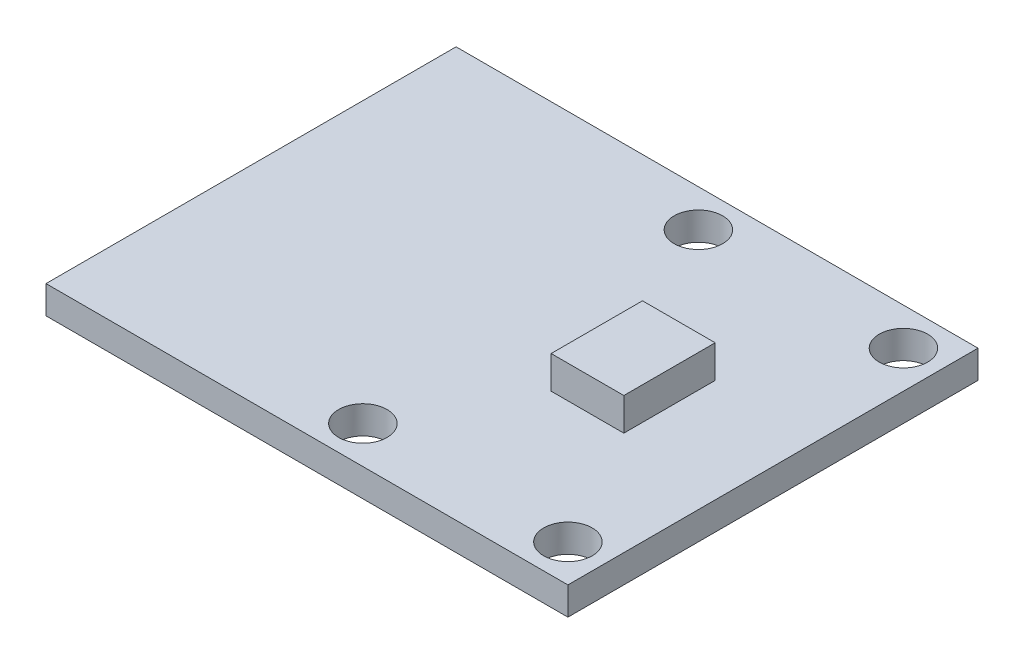
ISO-10303-21;
HEADER;
FILE_DESCRIPTION(('STEP AP214'),'2;1');
FILE_NAME('part.step','',(''),(''),'','','');
FILE_SCHEMA(('AUTOMOTIVE_DESIGN { 1 0 10303 214 1 1 1 1 }'));
ENDSEC;
DATA;
#1=APPLICATION_CONTEXT('core data for automotive mechanical design processes');
#2=APPLICATION_PROTOCOL_DEFINITION('international standard','automotive_design',2000,#1);
#3=PRODUCT_CONTEXT('',#1,'mechanical');
#4=PRODUCT('Part','Part','',(#3));
#5=PRODUCT_RELATED_PRODUCT_CATEGORY('part','',(#4));
#6=PRODUCT_DEFINITION_FORMATION('','',#4);
#7=PRODUCT_DEFINITION_CONTEXT('part definition',#1,'design');
#8=PRODUCT_DEFINITION('design','',#6,#7);
#9=PRODUCT_DEFINITION_SHAPE('','',#8);
#10=(LENGTH_UNIT() NAMED_UNIT(*) SI_UNIT(.MILLI.,.METRE.));
#11=(NAMED_UNIT(*) PLANE_ANGLE_UNIT() SI_UNIT($,.RADIAN.));
#12=(NAMED_UNIT(*) SI_UNIT($,.STERADIAN.) SOLID_ANGLE_UNIT());
#13=UNCERTAINTY_MEASURE_WITH_UNIT(LENGTH_MEASURE(1.E-05),#10,'distance_accuracy_value','');
#14=(GEOMETRIC_REPRESENTATION_CONTEXT(3) GLOBAL_UNCERTAINTY_ASSIGNED_CONTEXT((#13)) GLOBAL_UNIT_ASSIGNED_CONTEXT((#10,
#11,#12)) REPRESENTATION_CONTEXT('',''));
#15=CARTESIAN_POINT('',(0.,0.,0.));
#16=DIRECTION('',(0.,0.,1.));
#17=DIRECTION('',(1.,0.,0.));
#18=AXIS2_PLACEMENT_3D('',#15,#16,#17);
#19=CARTESIAN_POINT('',(0.,1.5,0.));
#20=DIRECTION('',(0.,-1.,0.));
#21=DIRECTION('',(0.,0.,-1.));
#22=AXIS2_PLACEMENT_3D('',#19,#20,#21);
#23=PLANE('',#22);
#24=CARTESIAN_POINT('',(1.,1.5,9.));
#25=DIRECTION('',(0.,1.,0.));
#26=DIRECTION('',(0.,0.,1.));
#27=AXIS2_PLACEMENT_3D('',#24,#25,#26);
#28=CIRCLE('',#27,1.3);
#29=CARTESIAN_POINT('',(1.,1.5,10.3));
#30=VERTEX_POINT('',#29);
#31=EDGE_CURVE('E184',#30,#30,#28,.T.);
#32=ORIENTED_EDGE('',*,*,#31,.F.);
#33=EDGE_LOOP('',(#32));
#34=FACE_BOUND('',#33,.T.);
#35=CARTESIAN_POINT('',(12.,1.5,-9.));
#36=DIRECTION('',(0.,1.,0.));
#37=DIRECTION('',(0.,0.,-1.));
#38=AXIS2_PLACEMENT_3D('',#35,#36,#37);
#39=CIRCLE('',#38,1.3);
#40=CARTESIAN_POINT('',(12.,1.5,-10.3));
#41=VERTEX_POINT('',#40);
#42=EDGE_CURVE('E185',#41,#41,#39,.T.);
#43=ORIENTED_EDGE('',*,*,#42,.F.);
#44=EDGE_LOOP('',(#43));
#45=FACE_BOUND('',#44,.T.);
#46=CARTESIAN_POINT('',(1.,1.5,-9.));
#47=DIRECTION('',(0.,1.,0.));
#48=DIRECTION('',(0.,0.,-1.));
#49=AXIS2_PLACEMENT_3D('',#46,#47,#48);
#50=CIRCLE('',#49,1.3);
#51=CARTESIAN_POINT('',(1.,1.5,-10.3));
#52=VERTEX_POINT('',#51);
#53=EDGE_CURVE('E188',#52,#52,#50,.T.);
#54=ORIENTED_EDGE('',*,*,#53,.F.);
#55=EDGE_LOOP('',(#54));
#56=FACE_BOUND('',#55,.T.);
#57=CARTESIAN_POINT('',(12.,1.5,9.));
#58=DIRECTION('',(0.,1.,0.));
#59=DIRECTION('',(0.,0.,1.));
#60=AXIS2_PLACEMENT_3D('',#57,#58,#59);
#61=CIRCLE('',#60,1.3);
#62=CARTESIAN_POINT('',(12.,1.5,10.3));
#63=VERTEX_POINT('',#62);
#64=EDGE_CURVE('E157',#63,#63,#61,.T.);
#65=ORIENTED_EDGE('',*,*,#64,.F.);
#66=EDGE_LOOP('',(#65));
#67=FACE_BOUND('',#66,.T.);
#68=DIRECTION('',(0.,0.,-1.));
#69=VECTOR('',#68,1.);
#70=CARTESIAN_POINT('',(14.,1.5,11.));
#71=LINE('',#70,#69);
#72=CARTESIAN_POINT('',(14.,1.5,11.));
#73=VERTEX_POINT('',#72);
#74=CARTESIAN_POINT('',(14.,1.5,-11.));
#75=VERTEX_POINT('',#74);
#76=EDGE_CURVE('E131',#73,#75,#71,.T.);
#77=ORIENTED_EDGE('',*,*,#76,.T.);
#78=DIRECTION('',(-1.,0.,0.));
#79=VECTOR('',#78,1.);
#80=CARTESIAN_POINT('',(-14.,1.5,-11.));
#81=LINE('',#80,#79);
#82=CARTESIAN_POINT('',(-14.,1.5,-11.));
#83=VERTEX_POINT('',#82);
#84=EDGE_CURVE('E134',#75,#83,#81,.T.);
#85=ORIENTED_EDGE('',*,*,#84,.T.);
#86=DIRECTION('',(0.,0.,1.));
#87=VECTOR('',#86,1.);
#88=CARTESIAN_POINT('',(-14.,1.5,11.));
#89=LINE('',#88,#87);
#90=CARTESIAN_POINT('',(-14.,1.5,11.));
#91=VERTEX_POINT('',#90);
#92=EDGE_CURVE('E137',#83,#91,#89,.T.);
#93=ORIENTED_EDGE('',*,*,#92,.T.);
#94=DIRECTION('',(1.,0.,0.));
#95=VECTOR('',#94,1.);
#96=CARTESIAN_POINT('',(-14.,1.5,11.));
#97=LINE('',#96,#95);
#98=EDGE_CURVE('E139',#91,#73,#97,.T.);
#99=ORIENTED_EDGE('',*,*,#98,.T.);
#100=EDGE_LOOP('',(#77,#85,#93,#99));
#101=FACE_BOUND('',#100,.T.);
#102=DIRECTION('',(0.,0.,-1.));
#103=VECTOR('',#102,1.);
#104=CARTESIAN_POINT('',(8.45,1.5,2.45));
#105=LINE('',#104,#103);
#106=CARTESIAN_POINT('',(8.45,1.5,2.45));
#107=VERTEX_POINT('',#106);
#108=CARTESIAN_POINT('',(8.45,1.5,-2.45));
#109=VERTEX_POINT('',#108);
#110=EDGE_CURVE('E121',#107,#109,#105,.T.);
#111=ORIENTED_EDGE('',*,*,#110,.F.);
#112=DIRECTION('',(1.,0.,0.));
#113=VECTOR('',#112,1.);
#114=CARTESIAN_POINT('',(4.55,1.5,2.45));
#115=LINE('',#114,#113);
#116=CARTESIAN_POINT('',(4.55,1.5,2.45));
#117=VERTEX_POINT('',#116);
#118=EDGE_CURVE('E118',#117,#107,#115,.T.);
#119=ORIENTED_EDGE('',*,*,#118,.F.);
#120=DIRECTION('',(0.,0.,1.));
#121=VECTOR('',#120,1.);
#122=CARTESIAN_POINT('',(4.55,1.5,2.45));
#123=LINE('',#122,#121);
#124=CARTESIAN_POINT('',(4.55,1.5,-2.45));
#125=VERTEX_POINT('',#124);
#126=EDGE_CURVE('E56',#125,#117,#123,.T.);
#127=ORIENTED_EDGE('',*,*,#126,.F.);
#128=DIRECTION('',(-1.,0.,0.));
#129=VECTOR('',#128,1.);
#130=CARTESIAN_POINT('',(4.55,1.5,-2.45));
#131=LINE('',#130,#129);
#132=EDGE_CURVE('E51',#109,#125,#131,.T.);
#133=ORIENTED_EDGE('',*,*,#132,.F.);
#134=EDGE_LOOP('',(#111,#119,#127,#133));
#135=FACE_BOUND('',#134,.T.);
#136=ADVANCED_FACE('F34',(#34,#45,#56,#67,#101,#135),#23,.F.);
#137=CARTESIAN_POINT('',(14.,1.5,11.));
#138=DIRECTION('',(-1.,0.,0.));
#139=DIRECTION('',(0.,0.,1.));
#140=AXIS2_PLACEMENT_3D('',#137,#138,#139);
#141=PLANE('',#140);
#142=DIRECTION('',(0.,0.,-1.));
#143=VECTOR('',#142,1.);
#144=CARTESIAN_POINT('',(14.,0.,11.));
#145=LINE('',#144,#143);
#146=CARTESIAN_POINT('',(14.,0.,11.));
#147=VERTEX_POINT('',#146);
#148=CARTESIAN_POINT('',(14.,0.,-11.));
#149=VERTEX_POINT('',#148);
#150=EDGE_CURVE('E122',#147,#149,#145,.T.);
#151=ORIENTED_EDGE('',*,*,#150,.T.);
#152=DIRECTION('',(0.,-1.,0.));
#153=VECTOR('',#152,1.);
#154=CARTESIAN_POINT('',(14.,1.5,-11.));
#155=LINE('',#154,#153);
#156=EDGE_CURVE('E11',#75,#149,#155,.T.);
#157=ORIENTED_EDGE('',*,*,#156,.F.);
#158=ORIENTED_EDGE('',*,*,#76,.F.);
#159=DIRECTION('',(0.,-1.,0.));
#160=VECTOR('',#159,1.);
#161=CARTESIAN_POINT('',(14.,1.5,11.));
#162=LINE('',#161,#160);
#163=EDGE_CURVE('E140',#73,#147,#162,.T.);
#164=ORIENTED_EDGE('',*,*,#163,.T.);
#165=EDGE_LOOP('',(#151,#157,#158,#164));
#166=FACE_BOUND('',#165,.T.);
#167=ADVANCED_FACE('F36',(#166),#141,.F.);
#168=CARTESIAN_POINT('',(-14.,1.5,-11.));
#169=DIRECTION('',(0.,0.,1.));
#170=DIRECTION('',(1.,0.,0.));
#171=AXIS2_PLACEMENT_3D('',#168,#169,#170);
#172=PLANE('',#171);
#173=DIRECTION('',(-1.,0.,0.));
#174=VECTOR('',#173,1.);
#175=CARTESIAN_POINT('',(-14.,0.,-11.));
#176=LINE('',#175,#174);
#177=CARTESIAN_POINT('',(-14.,0.,-11.));
#178=VERTEX_POINT('',#177);
#179=EDGE_CURVE('E125',#149,#178,#176,.T.);
#180=ORIENTED_EDGE('',*,*,#179,.T.);
#181=DIRECTION('',(0.,-1.,0.));
#182=VECTOR('',#181,1.);
#183=CARTESIAN_POINT('',(-14.,1.5,-11.));
#184=LINE('',#183,#182);
#185=EDGE_CURVE('E43',#83,#178,#184,.T.);
#186=ORIENTED_EDGE('',*,*,#185,.F.);
#187=ORIENTED_EDGE('',*,*,#84,.F.);
#188=ORIENTED_EDGE('',*,*,#156,.T.);
#189=EDGE_LOOP('',(#180,#186,#187,#188));
#190=FACE_BOUND('',#189,.T.);
#191=ADVANCED_FACE('F210',(#190),#172,.F.);
#192=CARTESIAN_POINT('',(-14.,1.5,11.));
#193=DIRECTION('',(1.,0.,0.));
#194=DIRECTION('',(0.,0.,-1.));
#195=AXIS2_PLACEMENT_3D('',#192,#193,#194);
#196=PLANE('',#195);
#197=DIRECTION('',(0.,0.,1.));
#198=VECTOR('',#197,1.);
#199=CARTESIAN_POINT('',(-14.,0.,11.));
#200=LINE('',#199,#198);
#201=CARTESIAN_POINT('',(-14.,0.,11.));
#202=VERTEX_POINT('',#201);
#203=EDGE_CURVE('E143',#178,#202,#200,.T.);
#204=ORIENTED_EDGE('',*,*,#203,.T.);
#205=DIRECTION('',(0.,-1.,0.));
#206=VECTOR('',#205,1.);
#207=CARTESIAN_POINT('',(-14.,1.5,11.));
#208=LINE('',#207,#206);
#209=EDGE_CURVE('E148',#91,#202,#208,.T.);
#210=ORIENTED_EDGE('',*,*,#209,.F.);
#211=ORIENTED_EDGE('',*,*,#92,.F.);
#212=ORIENTED_EDGE('',*,*,#185,.T.);
#213=EDGE_LOOP('',(#204,#210,#211,#212));
#214=FACE_BOUND('',#213,.T.);
#215=ADVANCED_FACE('F215',(#214),#196,.F.);
#216=CARTESIAN_POINT('',(-14.,1.5,11.));
#217=DIRECTION('',(0.,0.,-1.));
#218=DIRECTION('',(-1.,0.,0.));
#219=AXIS2_PLACEMENT_3D('',#216,#217,#218);
#220=PLANE('',#219);
#221=DIRECTION('',(1.,0.,0.));
#222=VECTOR('',#221,1.);
#223=CARTESIAN_POINT('',(-14.,0.,11.));
#224=LINE('',#223,#222);
#225=EDGE_CURVE('E135',#202,#147,#224,.T.);
#226=ORIENTED_EDGE('',*,*,#225,.T.);
#227=ORIENTED_EDGE('',*,*,#163,.F.);
#228=ORIENTED_EDGE('',*,*,#98,.F.);
#229=ORIENTED_EDGE('',*,*,#209,.T.);
#230=EDGE_LOOP('',(#226,#227,#228,#229));
#231=FACE_BOUND('',#230,.T.);
#232=ADVANCED_FACE('F218',(#231),#220,.F.);
#233=CARTESIAN_POINT('',(0.,0.,0.));
#234=DIRECTION('',(0.,-1.,0.));
#235=DIRECTION('',(0.,0.,-1.));
#236=AXIS2_PLACEMENT_3D('',#233,#234,#235);
#237=PLANE('',#236);
#238=CARTESIAN_POINT('',(1.,0.,9.));
#239=DIRECTION('',(0.,-1.,0.));
#240=DIRECTION('',(0.,0.,-1.));
#241=AXIS2_PLACEMENT_3D('',#238,#239,#240);
#242=CIRCLE('',#241,1.3);
#243=CARTESIAN_POINT('',(1.,0.,7.7));
#244=VERTEX_POINT('',#243);
#245=EDGE_CURVE('E38',#244,#244,#242,.T.);
#246=ORIENTED_EDGE('',*,*,#245,.F.);
#247=EDGE_LOOP('',(#246));
#248=FACE_BOUND('',#247,.T.);
#249=CARTESIAN_POINT('',(12.,0.,-9.));
#250=DIRECTION('',(0.,-1.,0.));
#251=DIRECTION('',(0.,0.,-1.));
#252=AXIS2_PLACEMENT_3D('',#249,#250,#251);
#253=CIRCLE('',#252,1.3);
#254=CARTESIAN_POINT('',(12.,0.,-10.3));
#255=VERTEX_POINT('',#254);
#256=EDGE_CURVE('E159',#255,#255,#253,.T.);
#257=ORIENTED_EDGE('',*,*,#256,.F.);
#258=EDGE_LOOP('',(#257));
#259=FACE_BOUND('',#258,.T.);
#260=CARTESIAN_POINT('',(1.,0.,-9.));
#261=DIRECTION('',(0.,-1.,0.));
#262=DIRECTION('',(0.,0.,-1.));
#263=AXIS2_PLACEMENT_3D('',#260,#261,#262);
#264=CIRCLE('',#263,1.3);
#265=CARTESIAN_POINT('',(1.,0.,-10.3));
#266=VERTEX_POINT('',#265);
#267=EDGE_CURVE('E156',#266,#266,#264,.T.);
#268=ORIENTED_EDGE('',*,*,#267,.F.);
#269=EDGE_LOOP('',(#268));
#270=FACE_BOUND('',#269,.T.);
#271=CARTESIAN_POINT('',(12.,0.,9.));
#272=DIRECTION('',(0.,-1.,0.));
#273=DIRECTION('',(0.,0.,-1.));
#274=AXIS2_PLACEMENT_3D('',#271,#272,#273);
#275=CIRCLE('',#274,1.3);
#276=CARTESIAN_POINT('',(12.,0.,7.7));
#277=VERTEX_POINT('',#276);
#278=EDGE_CURVE('E153',#277,#277,#275,.T.);
#279=ORIENTED_EDGE('',*,*,#278,.F.);
#280=EDGE_LOOP('',(#279));
#281=FACE_BOUND('',#280,.T.);
#282=ORIENTED_EDGE('',*,*,#150,.F.);
#283=ORIENTED_EDGE('',*,*,#225,.F.);
#284=ORIENTED_EDGE('',*,*,#203,.F.);
#285=ORIENTED_EDGE('',*,*,#179,.F.);
#286=EDGE_LOOP('',(#282,#283,#284,#285));
#287=FACE_BOUND('',#286,.T.);
#288=ADVANCED_FACE('F220',(#248,#259,#270,#281,#287),#237,.T.);
#289=CARTESIAN_POINT('',(8.45,3.25,2.45));
#290=DIRECTION('',(-1.,0.,0.));
#291=DIRECTION('',(0.,0.,1.));
#292=AXIS2_PLACEMENT_3D('',#289,#290,#291);
#293=PLANE('',#292);
#294=ORIENTED_EDGE('',*,*,#110,.T.);
#295=DIRECTION('',(0.,-1.,0.));
#296=VECTOR('',#295,1.);
#297=CARTESIAN_POINT('',(8.45,3.25,-2.45));
#298=LINE('',#297,#296);
#299=CARTESIAN_POINT('',(8.45,3.25,-2.45));
#300=VERTEX_POINT('',#299);
#301=EDGE_CURVE('E102',#300,#109,#298,.T.);
#302=ORIENTED_EDGE('',*,*,#301,.F.);
#303=DIRECTION('',(0.,0.,-1.));
#304=VECTOR('',#303,1.);
#305=CARTESIAN_POINT('',(8.45,3.25,2.45));
#306=LINE('',#305,#304);
#307=CARTESIAN_POINT('',(8.45,3.25,2.45));
#308=VERTEX_POINT('',#307);
#309=EDGE_CURVE('E109',#308,#300,#306,.T.);
#310=ORIENTED_EDGE('',*,*,#309,.F.);
#311=DIRECTION('',(0.,-1.,0.));
#312=VECTOR('',#311,1.);
#313=CARTESIAN_POINT('',(8.45,3.25,2.45));
#314=LINE('',#313,#312);
#315=EDGE_CURVE('E174',#308,#107,#314,.T.);
#316=ORIENTED_EDGE('',*,*,#315,.T.);
#317=EDGE_LOOP('',(#294,#302,#310,#316));
#318=FACE_BOUND('',#317,.T.);
#319=ADVANCED_FACE('F120',(#318),#293,.F.);
#320=CARTESIAN_POINT('',(4.55,3.25,-2.45));
#321=DIRECTION('',(0.,0.,1.));
#322=DIRECTION('',(1.,0.,0.));
#323=AXIS2_PLACEMENT_3D('',#320,#321,#322);
#324=PLANE('',#323);
#325=ORIENTED_EDGE('',*,*,#132,.T.);
#326=DIRECTION('',(0.,-1.,0.));
#327=VECTOR('',#326,1.);
#328=CARTESIAN_POINT('',(4.55,3.25,-2.45));
#329=LINE('',#328,#327);
#330=CARTESIAN_POINT('',(4.55,3.25,-2.45));
#331=VERTEX_POINT('',#330);
#332=EDGE_CURVE('E105',#331,#125,#329,.T.);
#333=ORIENTED_EDGE('',*,*,#332,.F.);
#334=DIRECTION('',(-1.,0.,0.));
#335=VECTOR('',#334,1.);
#336=CARTESIAN_POINT('',(4.55,3.25,-2.45));
#337=LINE('',#336,#335);
#338=EDGE_CURVE('E98',#300,#331,#337,.T.);
#339=ORIENTED_EDGE('',*,*,#338,.F.);
#340=ORIENTED_EDGE('',*,*,#301,.T.);
#341=EDGE_LOOP('',(#325,#333,#339,#340));
#342=FACE_BOUND('',#341,.T.);
#343=ADVANCED_FACE('F100',(#342),#324,.F.);
#344=CARTESIAN_POINT('',(4.55,3.25,2.45));
#345=DIRECTION('',(1.,0.,0.));
#346=DIRECTION('',(0.,0.,-1.));
#347=AXIS2_PLACEMENT_3D('',#344,#345,#346);
#348=PLANE('',#347);
#349=ORIENTED_EDGE('',*,*,#126,.T.);
#350=DIRECTION('',(0.,-1.,0.));
#351=VECTOR('',#350,1.);
#352=CARTESIAN_POINT('',(4.55,3.25,2.45));
#353=LINE('',#352,#351);
#354=CARTESIAN_POINT('',(4.55,3.25,2.45));
#355=VERTEX_POINT('',#354);
#356=EDGE_CURVE('E127',#355,#117,#353,.T.);
#357=ORIENTED_EDGE('',*,*,#356,.F.);
#358=DIRECTION('',(0.,0.,1.));
#359=VECTOR('',#358,1.);
#360=CARTESIAN_POINT('',(4.55,3.25,2.45));
#361=LINE('',#360,#359);
#362=EDGE_CURVE('E108',#331,#355,#361,.T.);
#363=ORIENTED_EDGE('',*,*,#362,.F.);
#364=ORIENTED_EDGE('',*,*,#332,.T.);
#365=EDGE_LOOP('',(#349,#357,#363,#364));
#366=FACE_BOUND('',#365,.T.);
#367=ADVANCED_FACE('F180',(#366),#348,.F.);
#368=CARTESIAN_POINT('',(4.55,3.25,2.45));
#369=DIRECTION('',(0.,0.,-1.));
#370=DIRECTION('',(-1.,0.,0.));
#371=AXIS2_PLACEMENT_3D('',#368,#369,#370);
#372=PLANE('',#371);
#373=ORIENTED_EDGE('',*,*,#118,.T.);
#374=ORIENTED_EDGE('',*,*,#315,.F.);
#375=DIRECTION('',(1.,0.,0.));
#376=VECTOR('',#375,1.);
#377=CARTESIAN_POINT('',(4.55,3.25,2.45));
#378=LINE('',#377,#376);
#379=EDGE_CURVE('E114',#355,#308,#378,.T.);
#380=ORIENTED_EDGE('',*,*,#379,.F.);
#381=ORIENTED_EDGE('',*,*,#356,.T.);
#382=EDGE_LOOP('',(#373,#374,#380,#381));
#383=FACE_BOUND('',#382,.T.);
#384=ADVANCED_FACE('F178',(#383),#372,.F.);
#385=CARTESIAN_POINT('',(0.,3.25,0.));
#386=DIRECTION('',(0.,-1.,0.));
#387=DIRECTION('',(0.,0.,-1.));
#388=AXIS2_PLACEMENT_3D('',#385,#386,#387);
#389=PLANE('',#388);
#390=ORIENTED_EDGE('',*,*,#309,.T.);
#391=ORIENTED_EDGE('',*,*,#338,.T.);
#392=ORIENTED_EDGE('',*,*,#362,.T.);
#393=ORIENTED_EDGE('',*,*,#379,.T.);
#394=EDGE_LOOP('',(#390,#391,#392,#393));
#395=FACE_BOUND('',#394,.T.);
#396=ADVANCED_FACE('F112',(#395),#389,.F.);
#397=CARTESIAN_POINT('',(12.,-0.25,9.));
#398=DIRECTION('',(0.,1.,0.));
#399=DIRECTION('',(0.,0.,1.));
#400=AXIS2_PLACEMENT_3D('',#397,#398,#399);
#401=CYLINDRICAL_SURFACE('',#400,1.3);
#402=ORIENTED_EDGE('',*,*,#278,.T.);
#403=EDGE_LOOP('',(#402));
#404=FACE_BOUND('',#403,.T.);
#405=ORIENTED_EDGE('',*,*,#64,.T.);
#406=EDGE_LOOP('',(#405));
#407=FACE_BOUND('',#406,.T.);
#408=ADVANCED_FACE('F259',(#404,#407),#401,.F.);
#409=CARTESIAN_POINT('',(1.,-0.25,-9.));
#410=DIRECTION('',(0.,1.,0.));
#411=DIRECTION('',(0.,0.,1.));
#412=AXIS2_PLACEMENT_3D('',#409,#410,#411);
#413=CYLINDRICAL_SURFACE('',#412,1.3);
#414=ORIENTED_EDGE('',*,*,#267,.T.);
#415=EDGE_LOOP('',(#414));
#416=FACE_BOUND('',#415,.T.);
#417=ORIENTED_EDGE('',*,*,#53,.T.);
#418=EDGE_LOOP('',(#417));
#419=FACE_BOUND('',#418,.T.);
#420=ADVANCED_FACE('F194',(#416,#419),#413,.F.);
#421=CARTESIAN_POINT('',(12.,-0.25,-9.));
#422=DIRECTION('',(0.,1.,0.));
#423=DIRECTION('',(0.,0.,1.));
#424=AXIS2_PLACEMENT_3D('',#421,#422,#423);
#425=CYLINDRICAL_SURFACE('',#424,1.3);
#426=ORIENTED_EDGE('',*,*,#256,.T.);
#427=EDGE_LOOP('',(#426));
#428=FACE_BOUND('',#427,.T.);
#429=ORIENTED_EDGE('',*,*,#42,.T.);
#430=EDGE_LOOP('',(#429));
#431=FACE_BOUND('',#430,.T.);
#432=ADVANCED_FACE('F273',(#428,#431),#425,.F.);
#433=CARTESIAN_POINT('',(1.,-0.25,9.));
#434=DIRECTION('',(0.,1.,0.));
#435=DIRECTION('',(0.,0.,1.));
#436=AXIS2_PLACEMENT_3D('',#433,#434,#435);
#437=CYLINDRICAL_SURFACE('',#436,1.3);
#438=ORIENTED_EDGE('',*,*,#245,.T.);
#439=EDGE_LOOP('',(#438));
#440=FACE_BOUND('',#439,.T.);
#441=ORIENTED_EDGE('',*,*,#31,.T.);
#442=EDGE_LOOP('',(#441));
#443=FACE_BOUND('',#442,.T.);
#444=ADVANCED_FACE('F283',(#440,#443),#437,.F.);
#445=CLOSED_SHELL('',(#136,#167,#191,#215,#232,#288,#319,#343,#367,#384,#396,#408,#420,#432,#444));
#446=MANIFOLD_SOLID_BREP('B2',#445);
#447=ADVANCED_BREP_SHAPE_REPRESENTATION('',(#18,#446),#14);
#448=SHAPE_DEFINITION_REPRESENTATION(#9,#447);
ENDSEC;
END-ISO-10303-21;
